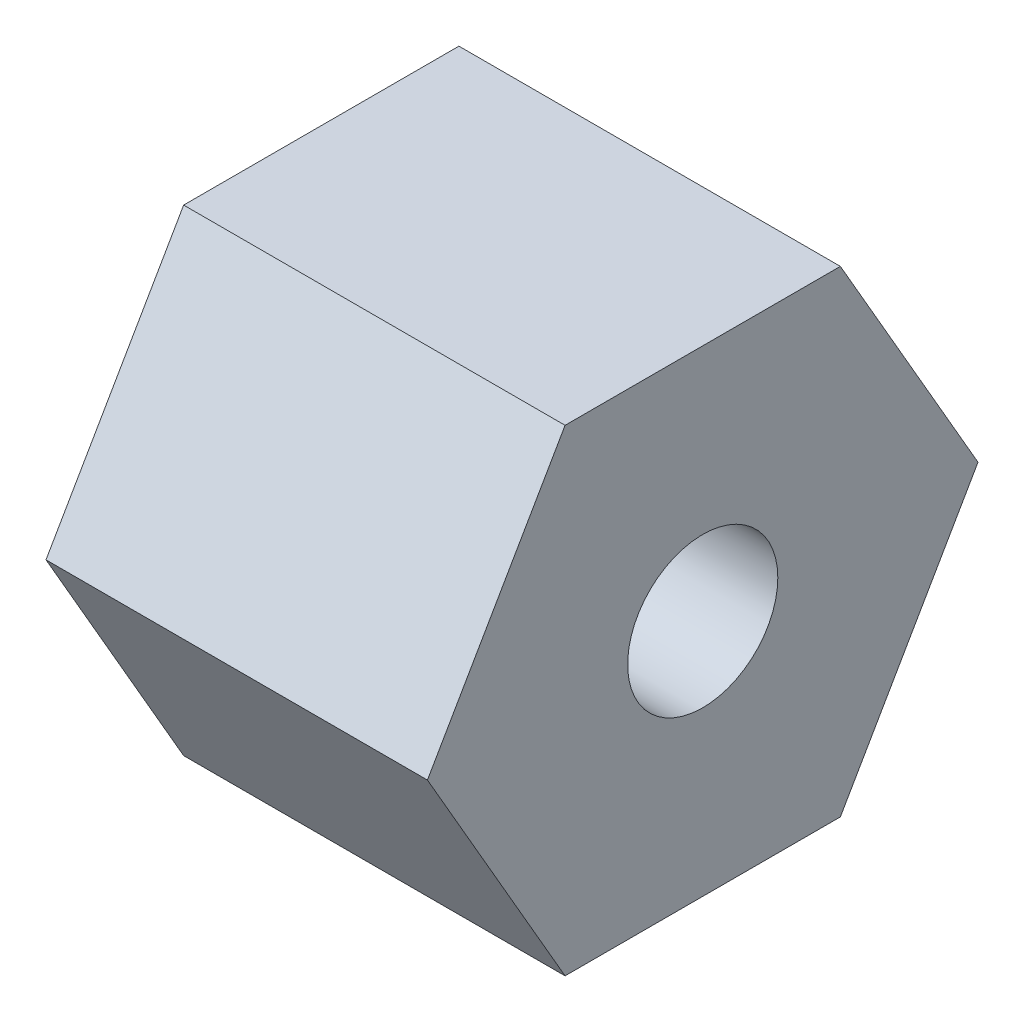
ISO-10303-21;
HEADER;
FILE_DESCRIPTION(('STEP AP214'),'2;1');
FILE_NAME('part.step','',(''),(''),'','','');
FILE_SCHEMA(('AUTOMOTIVE_DESIGN { 1 0 10303 214 1 1 1 1 }'));
ENDSEC;
DATA;
#1=APPLICATION_CONTEXT('core data for automotive mechanical design processes');
#2=APPLICATION_PROTOCOL_DEFINITION('international standard','automotive_design',2000,#1);
#3=PRODUCT_CONTEXT('',#1,'mechanical');
#4=PRODUCT('Part','Part','',(#3));
#5=PRODUCT_RELATED_PRODUCT_CATEGORY('part','',(#4));
#6=PRODUCT_DEFINITION_FORMATION('','',#4);
#7=PRODUCT_DEFINITION_CONTEXT('part definition',#1,'design');
#8=PRODUCT_DEFINITION('design','',#6,#7);
#9=PRODUCT_DEFINITION_SHAPE('','',#8);
#10=(LENGTH_UNIT() NAMED_UNIT(*) SI_UNIT(.MILLI.,.METRE.));
#11=(NAMED_UNIT(*) PLANE_ANGLE_UNIT() SI_UNIT($,.RADIAN.));
#12=(NAMED_UNIT(*) SI_UNIT($,.STERADIAN.) SOLID_ANGLE_UNIT());
#13=UNCERTAINTY_MEASURE_WITH_UNIT(LENGTH_MEASURE(1.E-05),#10,'distance_accuracy_value','');
#14=(GEOMETRIC_REPRESENTATION_CONTEXT(3) GLOBAL_UNCERTAINTY_ASSIGNED_CONTEXT((#13)) GLOBAL_UNIT_ASSIGNED_CONTEXT((#10,
#11,#12)) REPRESENTATION_CONTEXT('',''));
#15=CARTESIAN_POINT('',(0.,0.,0.));
#16=DIRECTION('',(0.,0.,1.));
#17=DIRECTION('',(1.,0.,0.));
#18=AXIS2_PLACEMENT_3D('',#15,#16,#17);
#19=CARTESIAN_POINT('',(5.08,0.,0.));
#20=DIRECTION('',(1.,0.,0.));
#21=DIRECTION('',(0.,0.,-1.));
#22=AXIS2_PLACEMENT_3D('',#19,#20,#21);
#23=PLANE('',#22);
#24=DIRECTION('',(0.,0.866025403784442,-0.499999999999995));
#25=VECTOR('',#24,1.);
#26=CARTESIAN_POINT('',(5.08,-6.34999999999993,-3.66617420935418));
#27=LINE('',#26,#25);
#28=CARTESIAN_POINT('',(5.08,-6.34999999999993,-3.66617420935418));
#29=VERTEX_POINT('',#28);
#30=CARTESIAN_POINT('',(5.08,0.,-7.33234841870822));
#31=VERTEX_POINT('',#30);
#32=EDGE_CURVE('E129',#29,#31,#27,.T.);
#33=ORIENTED_EDGE('',*,*,#32,.T.);
#34=DIRECTION('',(0.,0.866025403784438,0.500000000000001));
#35=VECTOR('',#34,1.);
#36=CARTESIAN_POINT('',(5.08,0.,-7.33234841870822));
#37=LINE('',#36,#35);
#38=CARTESIAN_POINT('',(5.08,6.34999999999999,-3.6661742093541));
#39=VERTEX_POINT('',#38);
#40=EDGE_CURVE('E87',#31,#39,#37,.T.);
#41=ORIENTED_EDGE('',*,*,#40,.T.);
#42=DIRECTION('',(0.,0.,1.));
#43=VECTOR('',#42,1.);
#44=CARTESIAN_POINT('',(5.08,6.34999999999999,-3.6661742093541));
#45=LINE('',#44,#43);
#46=CARTESIAN_POINT('',(5.08,6.34999999999996,3.66617420935414));
#47=VERTEX_POINT('',#46);
#48=EDGE_CURVE('E100',#39,#47,#45,.T.);
#49=ORIENTED_EDGE('',*,*,#48,.T.);
#50=DIRECTION('',(0.,-0.866025403784442,0.499999999999995));
#51=VECTOR('',#50,1.);
#52=CARTESIAN_POINT('',(5.08,6.34999999999996,3.66617420935414));
#53=LINE('',#52,#51);
#54=CARTESIAN_POINT('',(5.08,0.,7.33234841870822));
#55=VERTEX_POINT('',#54);
#56=EDGE_CURVE('E94',#47,#55,#53,.T.);
#57=ORIENTED_EDGE('',*,*,#56,.T.);
#58=DIRECTION('',(0.,-0.866025403784435,-0.500000000000007));
#59=VECTOR('',#58,1.);
#60=CARTESIAN_POINT('',(5.08,0.,7.33234841870822));
#61=LINE('',#60,#59);
#62=CARTESIAN_POINT('',(5.08,-6.35000000000001,3.66617420935405));
#63=VERTEX_POINT('',#62);
#64=EDGE_CURVE('E98',#55,#63,#61,.T.);
#65=ORIENTED_EDGE('',*,*,#64,.T.);
#66=DIRECTION('',(0.,0.,-1.));
#67=VECTOR('',#66,1.);
#68=CARTESIAN_POINT('',(5.08,-6.35000000000001,3.66617420935405));
#69=LINE('',#68,#67);
#70=EDGE_CURVE('E50',#63,#29,#69,.T.);
#71=ORIENTED_EDGE('',*,*,#70,.T.);
#72=EDGE_LOOP('',(#33,#41,#49,#57,#65,#71));
#73=FACE_BOUND('',#72,.T.);
#74=CARTESIAN_POINT('',(5.08,0.,0.));
#75=DIRECTION('',(1.,0.,0.));
#76=DIRECTION('',(0.,0.,-1.));
#77=AXIS2_PLACEMENT_3D('',#74,#75,#76);
#78=CIRCLE('',#77,2.);
#79=CARTESIAN_POINT('',(5.08,0.,-2.));
#80=VERTEX_POINT('',#79);
#81=EDGE_CURVE('E122',#80,#80,#78,.T.);
#82=ORIENTED_EDGE('',*,*,#81,.F.);
#83=EDGE_LOOP('',(#82));
#84=FACE_BOUND('',#83,.T.);
#85=ADVANCED_FACE('F33',(#73,#84),#23,.T.);
#86=CARTESIAN_POINT('',(-5.08,0.,0.));
#87=DIRECTION('',(1.,0.,0.));
#88=DIRECTION('',(0.,0.,-1.));
#89=AXIS2_PLACEMENT_3D('',#86,#87,#88);
#90=PLANE('',#89);
#91=DIRECTION('',(0.,0.866025403784442,-0.499999999999995));
#92=VECTOR('',#91,1.);
#93=CARTESIAN_POINT('',(-5.08,-6.34999999999993,-3.66617420935418));
#94=LINE('',#93,#92);
#95=CARTESIAN_POINT('',(-5.08,-6.34999999999993,-3.66617420935418));
#96=VERTEX_POINT('',#95);
#97=CARTESIAN_POINT('',(-5.08,0.,-7.33234841870822));
#98=VERTEX_POINT('',#97);
#99=EDGE_CURVE('E118',#96,#98,#94,.T.);
#100=ORIENTED_EDGE('',*,*,#99,.F.);
#101=DIRECTION('',(0.,0.,-1.));
#102=VECTOR('',#101,1.);
#103=CARTESIAN_POINT('',(-5.08,-6.35000000000001,3.66617420935405));
#104=LINE('',#103,#102);
#105=CARTESIAN_POINT('',(-5.08,-6.35000000000001,3.66617420935405));
#106=VERTEX_POINT('',#105);
#107=EDGE_CURVE('E79',#106,#96,#104,.T.);
#108=ORIENTED_EDGE('',*,*,#107,.F.);
#109=DIRECTION('',(0.,-0.866025403784435,-0.500000000000007));
#110=VECTOR('',#109,1.);
#111=CARTESIAN_POINT('',(-5.08,0.,7.33234841870822));
#112=LINE('',#111,#110);
#113=CARTESIAN_POINT('',(-5.08,0.,7.33234841870822));
#114=VERTEX_POINT('',#113);
#115=EDGE_CURVE('E73',#114,#106,#112,.T.);
#116=ORIENTED_EDGE('',*,*,#115,.F.);
#117=DIRECTION('',(0.,-0.866025403784442,0.499999999999995));
#118=VECTOR('',#117,1.);
#119=CARTESIAN_POINT('',(-5.08,6.34999999999996,3.66617420935414));
#120=LINE('',#119,#118);
#121=CARTESIAN_POINT('',(-5.08,6.34999999999996,3.66617420935414));
#122=VERTEX_POINT('',#121);
#123=EDGE_CURVE('E108',#122,#114,#120,.T.);
#124=ORIENTED_EDGE('',*,*,#123,.F.);
#125=DIRECTION('',(0.,0.,1.));
#126=VECTOR('',#125,1.);
#127=CARTESIAN_POINT('',(-5.08,6.34999999999999,-3.6661742093541));
#128=LINE('',#127,#126);
#129=CARTESIAN_POINT('',(-5.08,6.34999999999999,-3.6661742093541));
#130=VERTEX_POINT('',#129);
#131=EDGE_CURVE('E124',#130,#122,#128,.T.);
#132=ORIENTED_EDGE('',*,*,#131,.F.);
#133=DIRECTION('',(0.,0.866025403784438,0.500000000000001));
#134=VECTOR('',#133,1.);
#135=CARTESIAN_POINT('',(-5.08,0.,-7.33234841870822));
#136=LINE('',#135,#134);
#137=EDGE_CURVE('E121',#98,#130,#136,.T.);
#138=ORIENTED_EDGE('',*,*,#137,.F.);
#139=EDGE_LOOP('',(#100,#108,#116,#124,#132,#138));
#140=FACE_BOUND('',#139,.T.);
#141=CARTESIAN_POINT('',(-5.08,0.,0.));
#142=DIRECTION('',(1.,0.,0.));
#143=DIRECTION('',(0.,0.,-1.));
#144=AXIS2_PLACEMENT_3D('',#141,#142,#143);
#145=CIRCLE('',#144,2.);
#146=CARTESIAN_POINT('',(-5.08,0.,-2.));
#147=VERTEX_POINT('',#146);
#148=EDGE_CURVE('E222',#147,#147,#145,.T.);
#149=ORIENTED_EDGE('',*,*,#148,.T.);
#150=EDGE_LOOP('',(#149));
#151=FACE_BOUND('',#150,.T.);
#152=ADVANCED_FACE('F138',(#140,#151),#90,.F.);
#153=CARTESIAN_POINT('',(5.08,-6.34999999999993,-3.66617420935418));
#154=DIRECTION('',(0.,0.499999999999995,0.866025403784441));
#155=DIRECTION('',(0.,-0.866025403784442,0.499999999999995));
#156=AXIS2_PLACEMENT_3D('',#153,#154,#155);
#157=PLANE('',#156);
#158=ORIENTED_EDGE('',*,*,#99,.T.);
#159=DIRECTION('',(-1.,0.,0.));
#160=VECTOR('',#159,1.);
#161=CARTESIAN_POINT('',(5.08,0.,-7.33234841870822));
#162=LINE('',#161,#160);
#163=EDGE_CURVE('E11',#31,#98,#162,.T.);
#164=ORIENTED_EDGE('',*,*,#163,.F.);
#165=ORIENTED_EDGE('',*,*,#32,.F.);
#166=DIRECTION('',(-1.,0.,0.));
#167=VECTOR('',#166,1.);
#168=CARTESIAN_POINT('',(5.08,-6.34999999999993,-3.66617420935418));
#169=LINE('',#168,#167);
#170=EDGE_CURVE('E114',#29,#96,#169,.T.);
#171=ORIENTED_EDGE('',*,*,#170,.T.);
#172=EDGE_LOOP('',(#158,#164,#165,#171));
#173=FACE_BOUND('',#172,.T.);
#174=ADVANCED_FACE('F35',(#173),#157,.F.);
#175=CARTESIAN_POINT('',(5.08,0.,-7.33234841870822));
#176=DIRECTION('',(0.,-0.500000000000001,0.866025403784438));
#177=DIRECTION('',(0.,-0.866025403784438,-0.500000000000001));
#178=AXIS2_PLACEMENT_3D('',#175,#176,#177);
#179=PLANE('',#178);
#180=ORIENTED_EDGE('',*,*,#137,.T.);
#181=DIRECTION('',(-1.,0.,0.));
#182=VECTOR('',#181,1.);
#183=CARTESIAN_POINT('',(5.08,6.34999999999999,-3.6661742093541));
#184=LINE('',#183,#182);
#185=EDGE_CURVE('E42',#39,#130,#184,.T.);
#186=ORIENTED_EDGE('',*,*,#185,.F.);
#187=ORIENTED_EDGE('',*,*,#40,.F.);
#188=ORIENTED_EDGE('',*,*,#163,.T.);
#189=EDGE_LOOP('',(#180,#186,#187,#188));
#190=FACE_BOUND('',#189,.T.);
#191=ADVANCED_FACE('F163',(#190),#179,.F.);
#192=CARTESIAN_POINT('',(5.08,6.34999999999999,-3.6661742093541));
#193=DIRECTION('',(0.,-1.,0.));
#194=DIRECTION('',(0.,0.,-1.));
#195=AXIS2_PLACEMENT_3D('',#192,#193,#194);
#196=PLANE('',#195);
#197=ORIENTED_EDGE('',*,*,#131,.T.);
#198=DIRECTION('',(-1.,0.,0.));
#199=VECTOR('',#198,1.);
#200=CARTESIAN_POINT('',(5.08,6.34999999999996,3.66617420935414));
#201=LINE('',#200,#199);
#202=EDGE_CURVE('E109',#47,#122,#201,.T.);
#203=ORIENTED_EDGE('',*,*,#202,.F.);
#204=ORIENTED_EDGE('',*,*,#48,.F.);
#205=ORIENTED_EDGE('',*,*,#185,.T.);
#206=EDGE_LOOP('',(#197,#203,#204,#205));
#207=FACE_BOUND('',#206,.T.);
#208=ADVANCED_FACE('F135',(#207),#196,.F.);
#209=CARTESIAN_POINT('',(5.08,6.34999999999996,3.66617420935414));
#210=DIRECTION('',(0.,-0.499999999999995,-0.866025403784441));
#211=DIRECTION('',(0.,0.866025403784442,-0.499999999999995));
#212=AXIS2_PLACEMENT_3D('',#209,#210,#211);
#213=PLANE('',#212);
#214=ORIENTED_EDGE('',*,*,#123,.T.);
#215=DIRECTION('',(-1.,0.,0.));
#216=VECTOR('',#215,1.);
#217=CARTESIAN_POINT('',(5.08,0.,7.33234841870822));
#218=LINE('',#217,#216);
#219=EDGE_CURVE('E105',#55,#114,#218,.T.);
#220=ORIENTED_EDGE('',*,*,#219,.F.);
#221=ORIENTED_EDGE('',*,*,#56,.F.);
#222=ORIENTED_EDGE('',*,*,#202,.T.);
#223=EDGE_LOOP('',(#214,#220,#221,#222));
#224=FACE_BOUND('',#223,.T.);
#225=ADVANCED_FACE('F106',(#224),#213,.F.);
#226=CARTESIAN_POINT('',(5.08,0.,7.33234841870822));
#227=DIRECTION('',(0.,0.500000000000007,-0.866025403784434));
#228=DIRECTION('',(0.,0.866025403784435,0.500000000000007));
#229=AXIS2_PLACEMENT_3D('',#226,#227,#228);
#230=PLANE('',#229);
#231=ORIENTED_EDGE('',*,*,#115,.T.);
#232=DIRECTION('',(-1.,0.,0.));
#233=VECTOR('',#232,1.);
#234=CARTESIAN_POINT('',(5.08,-6.35000000000001,3.66617420935405));
#235=LINE('',#234,#233);
#236=EDGE_CURVE('E110',#63,#106,#235,.T.);
#237=ORIENTED_EDGE('',*,*,#236,.F.);
#238=ORIENTED_EDGE('',*,*,#64,.F.);
#239=ORIENTED_EDGE('',*,*,#219,.T.);
#240=EDGE_LOOP('',(#231,#237,#238,#239));
#241=FACE_BOUND('',#240,.T.);
#242=ADVANCED_FACE('F112',(#241),#230,.F.);
#243=CARTESIAN_POINT('',(5.08,-6.35000000000001,3.66617420935405));
#244=DIRECTION('',(0.,1.,0.));
#245=DIRECTION('',(0.,0.,1.));
#246=AXIS2_PLACEMENT_3D('',#243,#244,#245);
#247=PLANE('',#246);
#248=ORIENTED_EDGE('',*,*,#107,.T.);
#249=ORIENTED_EDGE('',*,*,#170,.F.);
#250=ORIENTED_EDGE('',*,*,#70,.F.);
#251=ORIENTED_EDGE('',*,*,#236,.T.);
#252=EDGE_LOOP('',(#248,#249,#250,#251));
#253=FACE_BOUND('',#252,.T.);
#254=ADVANCED_FACE('F143',(#253),#247,.F.);
#255=CARTESIAN_POINT('',(5.08,0.,0.));
#256=DIRECTION('',(-1.,0.,0.));
#257=DIRECTION('',(0.,0.,1.));
#258=AXIS2_PLACEMENT_3D('',#255,#256,#257);
#259=CYLINDRICAL_SURFACE('',#258,2.);
#260=ORIENTED_EDGE('',*,*,#81,.T.);
#261=EDGE_LOOP('',(#260));
#262=FACE_BOUND('',#261,.T.);
#263=ORIENTED_EDGE('',*,*,#148,.F.);
#264=EDGE_LOOP('',(#263));
#265=FACE_BOUND('',#264,.T.);
#266=ADVANCED_FACE('F145',(#262,#265),#259,.F.);
#267=CLOSED_SHELL('',(#85,#152,#174,#191,#208,#225,#242,#254,#266));
#268=MANIFOLD_SOLID_BREP('B2',#267);
#269=ADVANCED_BREP_SHAPE_REPRESENTATION('',(#18,#268),#14);
#270=SHAPE_DEFINITION_REPRESENTATION(#9,#269);
ENDSEC;
END-ISO-10303-21;
